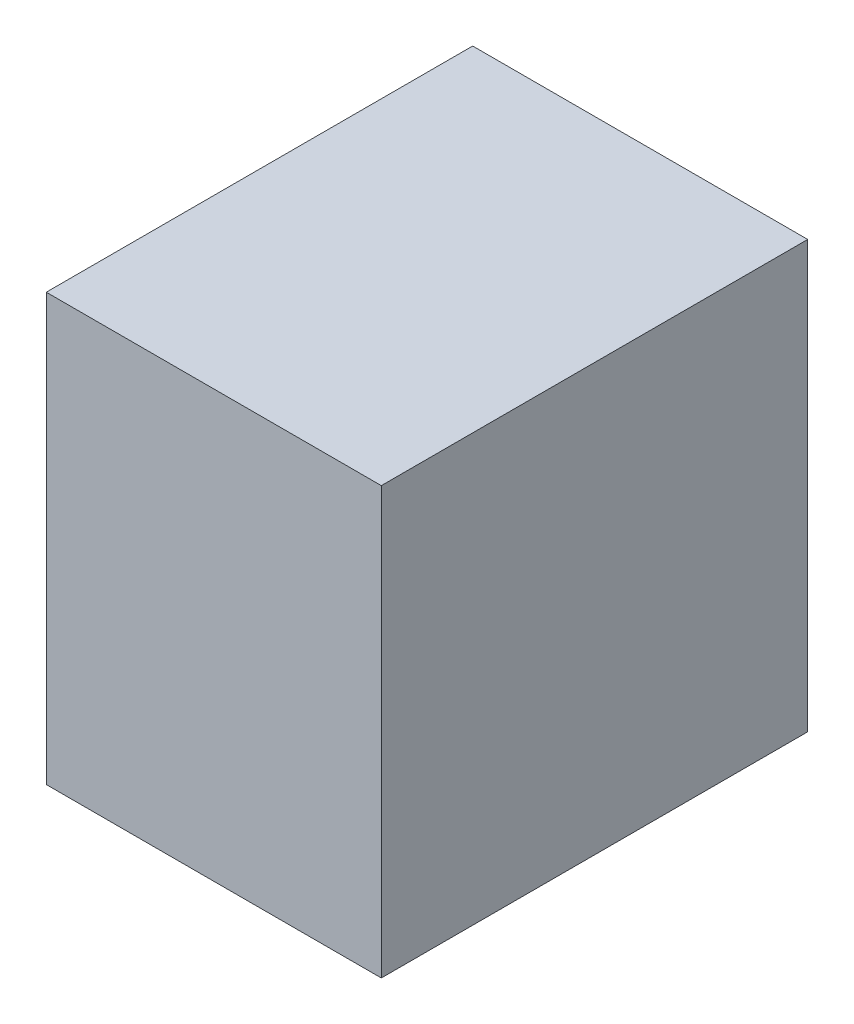
ISO-10303-21;
HEADER;
FILE_DESCRIPTION(('STEP AP214'),'2;1');
FILE_NAME('part.step','',(''),(''),'','','');
FILE_SCHEMA(('AUTOMOTIVE_DESIGN { 1 0 10303 214 1 1 1 1 }'));
ENDSEC;
DATA;
#1=APPLICATION_CONTEXT('core data for automotive mechanical design processes');
#2=APPLICATION_PROTOCOL_DEFINITION('international standard','automotive_design',2000,#1);
#3=PRODUCT_CONTEXT('',#1,'mechanical');
#4=PRODUCT('Part','Part','',(#3));
#5=PRODUCT_RELATED_PRODUCT_CATEGORY('part','',(#4));
#6=PRODUCT_DEFINITION_FORMATION('','',#4);
#7=PRODUCT_DEFINITION_CONTEXT('part definition',#1,'design');
#8=PRODUCT_DEFINITION('design','',#6,#7);
#9=PRODUCT_DEFINITION_SHAPE('','',#8);
#10=(LENGTH_UNIT() NAMED_UNIT(*) SI_UNIT(.MILLI.,.METRE.));
#11=(NAMED_UNIT(*) PLANE_ANGLE_UNIT() SI_UNIT($,.RADIAN.));
#12=(NAMED_UNIT(*) SI_UNIT($,.STERADIAN.) SOLID_ANGLE_UNIT());
#13=UNCERTAINTY_MEASURE_WITH_UNIT(LENGTH_MEASURE(1.E-05),#10,'distance_accuracy_value','');
#14=(GEOMETRIC_REPRESENTATION_CONTEXT(3) GLOBAL_UNCERTAINTY_ASSIGNED_CONTEXT((#13)) GLOBAL_UNIT_ASSIGNED_CONTEXT((#10,
#11,#12)) REPRESENTATION_CONTEXT('',''));
#15=CARTESIAN_POINT('',(0.,0.,0.));
#16=DIRECTION('',(0.,0.,1.));
#17=DIRECTION('',(1.,0.,0.));
#18=AXIS2_PLACEMENT_3D('',#15,#16,#17);
#19=CARTESIAN_POINT('',(-9.77777777777778,7.,-3.91493055555555));
#20=DIRECTION('',(1.,0.,0.));
#21=DIRECTION('',(0.,0.,-1.));
#22=AXIS2_PLACEMENT_3D('',#19,#20,#21);
#23=PLANE('',#22);
#24=DIRECTION('',(0.,0.,1.));
#25=VECTOR('',#24,1.);
#26=CARTESIAN_POINT('',(-9.77777777777778,0.,-3.91493055555555));
#27=LINE('',#26,#25);
#28=CARTESIAN_POINT('',(-9.77777777777778,0.,-3.91493055555555));
#29=VERTEX_POINT('',#28);
#30=CARTESIAN_POINT('',(-9.77777777777778,0.,3.08506944444445));
#31=VERTEX_POINT('',#30);
#32=EDGE_CURVE('E107',#29,#31,#27,.T.);
#33=ORIENTED_EDGE('',*,*,#32,.T.);
#34=DIRECTION('',(0.,-1.,0.));
#35=VECTOR('',#34,1.);
#36=CARTESIAN_POINT('',(-9.77777777777778,7.,3.08506944444445));
#37=LINE('',#36,#35);
#38=CARTESIAN_POINT('',(-9.77777777777778,7.,3.08506944444445));
#39=VERTEX_POINT('',#38);
#40=EDGE_CURVE('E11',#39,#31,#37,.T.);
#41=ORIENTED_EDGE('',*,*,#40,.F.);
#42=DIRECTION('',(0.,0.,1.));
#43=VECTOR('',#42,1.);
#44=CARTESIAN_POINT('',(-9.77777777777778,7.,-3.91493055555555));
#45=LINE('',#44,#43);
#46=CARTESIAN_POINT('',(-9.77777777777778,7.,-3.91493055555555));
#47=VERTEX_POINT('',#46);
#48=EDGE_CURVE('E91',#47,#39,#45,.T.);
#49=ORIENTED_EDGE('',*,*,#48,.F.);
#50=DIRECTION('',(0.,-1.,0.));
#51=VECTOR('',#50,1.);
#52=CARTESIAN_POINT('',(-9.77777777777778,7.,-3.91493055555555));
#53=LINE('',#52,#51);
#54=EDGE_CURVE('E103',#47,#29,#53,.T.);
#55=ORIENTED_EDGE('',*,*,#54,.T.);
#56=EDGE_LOOP('',(#33,#41,#49,#55));
#57=FACE_BOUND('',#56,.T.);
#58=ADVANCED_FACE('F39',(#57),#23,.F.);
#59=CARTESIAN_POINT('',(-9.77777777777778,7.,3.08506944444445));
#60=DIRECTION('',(0.,0.,-1.));
#61=DIRECTION('',(-1.,0.,0.));
#62=AXIS2_PLACEMENT_3D('',#59,#60,#61);
#63=PLANE('',#62);
#64=DIRECTION('',(1.,0.,0.));
#65=VECTOR('',#64,1.);
#66=CARTESIAN_POINT('',(-9.77777777777778,0.,3.08506944444445));
#67=LINE('',#66,#65);
#68=CARTESIAN_POINT('',(-4.27777777777777,0.,3.08506944444445));
#69=VERTEX_POINT('',#68);
#70=EDGE_CURVE('E96',#31,#69,#67,.T.);
#71=ORIENTED_EDGE('',*,*,#70,.T.);
#72=DIRECTION('',(0.,-1.,0.));
#73=VECTOR('',#72,1.);
#74=CARTESIAN_POINT('',(-4.27777777777777,7.,3.08506944444445));
#75=LINE('',#74,#73);
#76=CARTESIAN_POINT('',(-4.27777777777777,7.,3.08506944444445));
#77=VERTEX_POINT('',#76);
#78=EDGE_CURVE('E48',#77,#69,#75,.T.);
#79=ORIENTED_EDGE('',*,*,#78,.F.);
#80=DIRECTION('',(1.,0.,0.));
#81=VECTOR('',#80,1.);
#82=CARTESIAN_POINT('',(-9.77777777777778,7.,3.08506944444445));
#83=LINE('',#82,#81);
#84=EDGE_CURVE('E86',#39,#77,#83,.T.);
#85=ORIENTED_EDGE('',*,*,#84,.F.);
#86=ORIENTED_EDGE('',*,*,#40,.T.);
#87=EDGE_LOOP('',(#71,#79,#85,#86));
#88=FACE_BOUND('',#87,.T.);
#89=ADVANCED_FACE('F95',(#88),#63,.F.);
#90=CARTESIAN_POINT('',(-4.27777777777777,7.,-3.91493055555555));
#91=DIRECTION('',(-1.,0.,0.));
#92=DIRECTION('',(0.,0.,1.));
#93=AXIS2_PLACEMENT_3D('',#90,#91,#92);
#94=PLANE('',#93);
#95=DIRECTION('',(0.,0.,-1.));
#96=VECTOR('',#95,1.);
#97=CARTESIAN_POINT('',(-4.27777777777777,0.,-3.91493055555555));
#98=LINE('',#97,#96);
#99=CARTESIAN_POINT('',(-4.27777777777777,0.,-3.91493055555555));
#100=VERTEX_POINT('',#99);
#101=EDGE_CURVE('E73',#69,#100,#98,.T.);
#102=ORIENTED_EDGE('',*,*,#101,.T.);
#103=DIRECTION('',(0.,-1.,0.));
#104=VECTOR('',#103,1.);
#105=CARTESIAN_POINT('',(-4.27777777777777,7.,-3.91493055555555));
#106=LINE('',#105,#104);
#107=CARTESIAN_POINT('',(-4.27777777777777,7.,-3.91493055555555));
#108=VERTEX_POINT('',#107);
#109=EDGE_CURVE('E98',#108,#100,#106,.T.);
#110=ORIENTED_EDGE('',*,*,#109,.F.);
#111=DIRECTION('',(0.,0.,-1.));
#112=VECTOR('',#111,1.);
#113=CARTESIAN_POINT('',(-4.27777777777777,7.,-3.91493055555555));
#114=LINE('',#113,#112);
#115=EDGE_CURVE('E89',#77,#108,#114,.T.);
#116=ORIENTED_EDGE('',*,*,#115,.F.);
#117=ORIENTED_EDGE('',*,*,#78,.T.);
#118=EDGE_LOOP('',(#102,#110,#116,#117));
#119=FACE_BOUND('',#118,.T.);
#120=ADVANCED_FACE('F99',(#119),#94,.F.);
#121=CARTESIAN_POINT('',(-9.77777777777778,7.,-3.91493055555555));
#122=DIRECTION('',(0.,0.,1.));
#123=DIRECTION('',(1.,0.,0.));
#124=AXIS2_PLACEMENT_3D('',#121,#122,#123);
#125=PLANE('',#124);
#126=DIRECTION('',(-1.,0.,0.));
#127=VECTOR('',#126,1.);
#128=CARTESIAN_POINT('',(-9.77777777777778,0.,-3.91493055555555));
#129=LINE('',#128,#127);
#130=EDGE_CURVE('E79',#100,#29,#129,.T.);
#131=ORIENTED_EDGE('',*,*,#130,.T.);
#132=ORIENTED_EDGE('',*,*,#54,.F.);
#133=DIRECTION('',(-1.,0.,0.));
#134=VECTOR('',#133,1.);
#135=CARTESIAN_POINT('',(-9.77777777777778,7.,-3.91493055555555));
#136=LINE('',#135,#134);
#137=EDGE_CURVE('E56',#108,#47,#136,.T.);
#138=ORIENTED_EDGE('',*,*,#137,.F.);
#139=ORIENTED_EDGE('',*,*,#109,.T.);
#140=EDGE_LOOP('',(#131,#132,#138,#139));
#141=FACE_BOUND('',#140,.T.);
#142=ADVANCED_FACE('F120',(#141),#125,.F.);
#143=CARTESIAN_POINT('',(0.,7.,0.));
#144=DIRECTION('',(0.,1.,0.));
#145=DIRECTION('',(0.,0.,1.));
#146=AXIS2_PLACEMENT_3D('',#143,#144,#145);
#147=PLANE('',#146);
#148=ORIENTED_EDGE('',*,*,#48,.T.);
#149=ORIENTED_EDGE('',*,*,#84,.T.);
#150=ORIENTED_EDGE('',*,*,#115,.T.);
#151=ORIENTED_EDGE('',*,*,#137,.T.);
#152=EDGE_LOOP('',(#148,#149,#150,#151));
#153=FACE_BOUND('',#152,.T.);
#154=ADVANCED_FACE('F87',(#153),#147,.T.);
#155=CARTESIAN_POINT('',(0.,0.,0.));
#156=DIRECTION('',(0.,1.,0.));
#157=DIRECTION('',(0.,0.,1.));
#158=AXIS2_PLACEMENT_3D('',#155,#156,#157);
#159=PLANE('',#158);
#160=ORIENTED_EDGE('',*,*,#32,.F.);
#161=ORIENTED_EDGE('',*,*,#130,.F.);
#162=ORIENTED_EDGE('',*,*,#101,.F.);
#163=ORIENTED_EDGE('',*,*,#70,.F.);
#164=EDGE_LOOP('',(#160,#161,#162,#163));
#165=FACE_BOUND('',#164,.T.);
#166=ADVANCED_FACE('F123',(#165),#159,.F.);
#167=CLOSED_SHELL('',(#58,#89,#120,#142,#154,#166));
#168=MANIFOLD_SOLID_BREP('B2',#167);
#169=ADVANCED_BREP_SHAPE_REPRESENTATION('',(#18,#168),#14);
#170=SHAPE_DEFINITION_REPRESENTATION(#9,#169);
ENDSEC;
END-ISO-10303-21;
